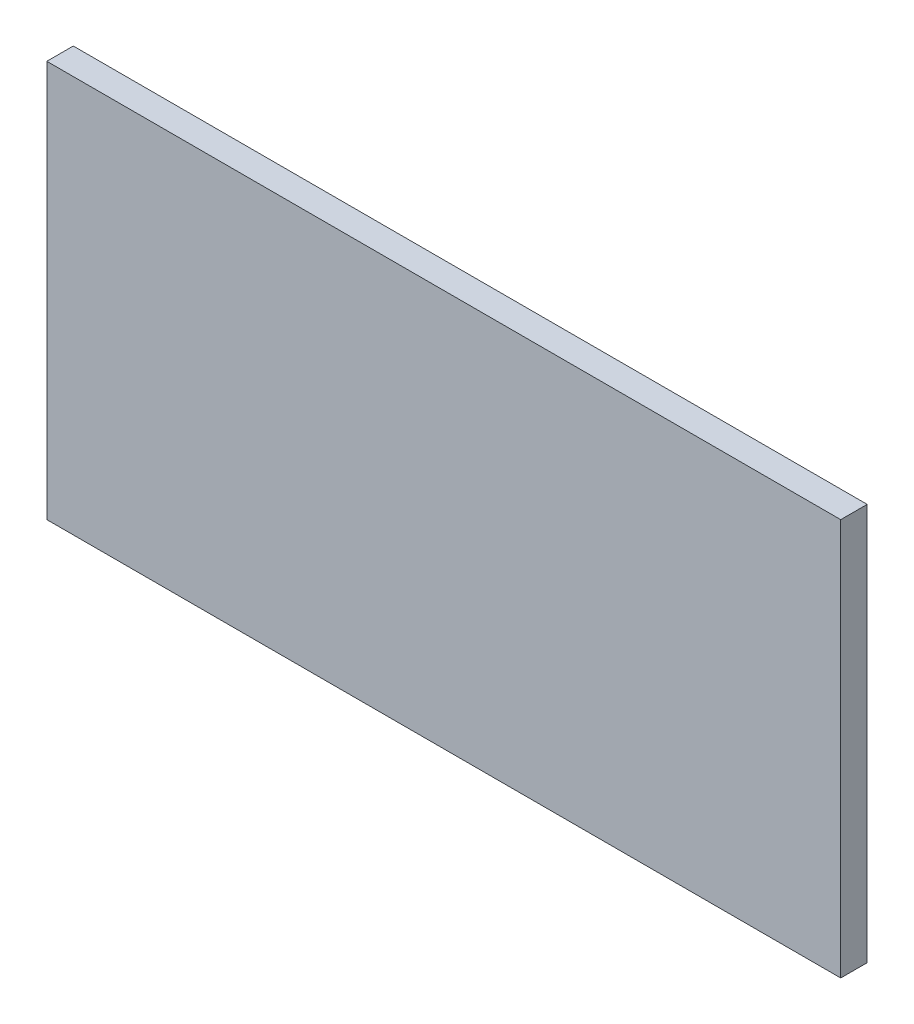
ISO-10303-21;
HEADER;
FILE_DESCRIPTION(('STEP AP214'),'2;1');
FILE_NAME('part.step','',(''),(''),'','','');
FILE_SCHEMA(('AUTOMOTIVE_DESIGN { 1 0 10303 214 1 1 1 1 }'));
ENDSEC;
DATA;
#1=APPLICATION_CONTEXT('core data for automotive mechanical design processes');
#2=APPLICATION_PROTOCOL_DEFINITION('international standard','automotive_design',2000,#1);
#3=PRODUCT_CONTEXT('',#1,'mechanical');
#4=PRODUCT('Part','Part','',(#3));
#5=PRODUCT_RELATED_PRODUCT_CATEGORY('part','',(#4));
#6=PRODUCT_DEFINITION_FORMATION('','',#4);
#7=PRODUCT_DEFINITION_CONTEXT('part definition',#1,'design');
#8=PRODUCT_DEFINITION('design','',#6,#7);
#9=PRODUCT_DEFINITION_SHAPE('','',#8);
#10=(LENGTH_UNIT() NAMED_UNIT(*) SI_UNIT(.MILLI.,.METRE.));
#11=(NAMED_UNIT(*) PLANE_ANGLE_UNIT() SI_UNIT($,.RADIAN.));
#12=(NAMED_UNIT(*) SI_UNIT($,.STERADIAN.) SOLID_ANGLE_UNIT());
#13=UNCERTAINTY_MEASURE_WITH_UNIT(LENGTH_MEASURE(1.E-05),#10,'distance_accuracy_value','');
#14=(GEOMETRIC_REPRESENTATION_CONTEXT(3) GLOBAL_UNCERTAINTY_ASSIGNED_CONTEXT((#13)) GLOBAL_UNIT_ASSIGNED_CONTEXT((#10,
#11,#12)) REPRESENTATION_CONTEXT('',''));
#15=CARTESIAN_POINT('',(0.,0.,0.));
#16=DIRECTION('',(0.,0.,1.));
#17=DIRECTION('',(1.,0.,0.));
#18=AXIS2_PLACEMENT_3D('',#15,#16,#17);
#19=CARTESIAN_POINT('',(-90.,-45.,-6.));
#20=DIRECTION('',(-1.,0.,0.));
#21=DIRECTION('',(0.,0.,1.));
#22=AXIS2_PLACEMENT_3D('',#19,#20,#21);
#23=PLANE('',#22);
#24=DIRECTION('',(0.,-1.,0.));
#25=VECTOR('',#24,1.);
#26=CARTESIAN_POINT('',(-90.,-45.,0.));
#27=LINE('',#26,#25);
#28=CARTESIAN_POINT('',(-90.,45.,0.));
#29=VERTEX_POINT('',#28);
#30=CARTESIAN_POINT('',(-90.,-45.,0.));
#31=VERTEX_POINT('',#30);
#32=EDGE_CURVE('E105',#29,#31,#27,.T.);
#33=ORIENTED_EDGE('',*,*,#32,.F.);
#34=DIRECTION('',(0.,0.,1.));
#35=VECTOR('',#34,1.);
#36=CARTESIAN_POINT('',(-90.,45.,-6.));
#37=LINE('',#36,#35);
#38=CARTESIAN_POINT('',(-90.,45.,-6.));
#39=VERTEX_POINT('',#38);
#40=EDGE_CURVE('E11',#39,#29,#37,.T.);
#41=ORIENTED_EDGE('',*,*,#40,.F.);
#42=DIRECTION('',(0.,-1.,0.));
#43=VECTOR('',#42,1.);
#44=CARTESIAN_POINT('',(-90.,-45.,-6.));
#45=LINE('',#44,#43);
#46=CARTESIAN_POINT('',(-90.,-45.,-6.));
#47=VERTEX_POINT('',#46);
#48=EDGE_CURVE('E99',#39,#47,#45,.T.);
#49=ORIENTED_EDGE('',*,*,#48,.T.);
#50=DIRECTION('',(0.,0.,1.));
#51=VECTOR('',#50,1.);
#52=CARTESIAN_POINT('',(-90.,-45.,-6.));
#53=LINE('',#52,#51);
#54=EDGE_CURVE('E44',#47,#31,#53,.T.);
#55=ORIENTED_EDGE('',*,*,#54,.T.);
#56=EDGE_LOOP('',(#33,#41,#49,#55));
#57=FACE_BOUND('',#56,.T.);
#58=ADVANCED_FACE('F41',(#57),#23,.T.);
#59=CARTESIAN_POINT('',(-90.,45.,-6.));
#60=DIRECTION('',(0.,1.,0.));
#61=DIRECTION('',(0.,0.,1.));
#62=AXIS2_PLACEMENT_3D('',#59,#60,#61);
#63=PLANE('',#62);
#64=DIRECTION('',(-1.,0.,0.));
#65=VECTOR('',#64,1.);
#66=CARTESIAN_POINT('',(-90.,45.,0.));
#67=LINE('',#66,#65);
#68=CARTESIAN_POINT('',(90.,45.,0.));
#69=VERTEX_POINT('',#68);
#70=EDGE_CURVE('E101',#69,#29,#67,.T.);
#71=ORIENTED_EDGE('',*,*,#70,.F.);
#72=DIRECTION('',(0.,0.,1.));
#73=VECTOR('',#72,1.);
#74=CARTESIAN_POINT('',(90.,45.,-6.));
#75=LINE('',#74,#73);
#76=CARTESIAN_POINT('',(90.,45.,-6.));
#77=VERTEX_POINT('',#76);
#78=EDGE_CURVE('E50',#77,#69,#75,.T.);
#79=ORIENTED_EDGE('',*,*,#78,.F.);
#80=DIRECTION('',(-1.,0.,0.));
#81=VECTOR('',#80,1.);
#82=CARTESIAN_POINT('',(-90.,45.,-6.));
#83=LINE('',#82,#81);
#84=EDGE_CURVE('E96',#77,#39,#83,.T.);
#85=ORIENTED_EDGE('',*,*,#84,.T.);
#86=ORIENTED_EDGE('',*,*,#40,.T.);
#87=EDGE_LOOP('',(#71,#79,#85,#86));
#88=FACE_BOUND('',#87,.T.);
#89=ADVANCED_FACE('F115',(#88),#63,.T.);
#90=CARTESIAN_POINT('',(90.,-45.,-6.));
#91=DIRECTION('',(1.,0.,0.));
#92=DIRECTION('',(0.,0.,-1.));
#93=AXIS2_PLACEMENT_3D('',#90,#91,#92);
#94=PLANE('',#93);
#95=DIRECTION('',(0.,1.,0.));
#96=VECTOR('',#95,1.);
#97=CARTESIAN_POINT('',(90.,-45.,0.));
#98=LINE('',#97,#96);
#99=CARTESIAN_POINT('',(90.,-45.,0.));
#100=VERTEX_POINT('',#99);
#101=EDGE_CURVE('E91',#100,#69,#98,.T.);
#102=ORIENTED_EDGE('',*,*,#101,.F.);
#103=DIRECTION('',(0.,0.,1.));
#104=VECTOR('',#103,1.);
#105=CARTESIAN_POINT('',(90.,-45.,-6.));
#106=LINE('',#105,#104);
#107=CARTESIAN_POINT('',(90.,-45.,-6.));
#108=VERTEX_POINT('',#107);
#109=EDGE_CURVE('E86',#108,#100,#106,.T.);
#110=ORIENTED_EDGE('',*,*,#109,.F.);
#111=DIRECTION('',(0.,1.,0.));
#112=VECTOR('',#111,1.);
#113=CARTESIAN_POINT('',(90.,-45.,-6.));
#114=LINE('',#113,#112);
#115=EDGE_CURVE('E89',#108,#77,#114,.T.);
#116=ORIENTED_EDGE('',*,*,#115,.T.);
#117=ORIENTED_EDGE('',*,*,#78,.T.);
#118=EDGE_LOOP('',(#102,#110,#116,#117));
#119=FACE_BOUND('',#118,.T.);
#120=ADVANCED_FACE('F88',(#119),#94,.T.);
#121=CARTESIAN_POINT('',(-90.,-45.,-6.));
#122=DIRECTION('',(0.,-1.,0.));
#123=DIRECTION('',(0.,0.,-1.));
#124=AXIS2_PLACEMENT_3D('',#121,#122,#123);
#125=PLANE('',#124);
#126=DIRECTION('',(1.,0.,0.));
#127=VECTOR('',#126,1.);
#128=CARTESIAN_POINT('',(-90.,-45.,0.));
#129=LINE('',#128,#127);
#130=EDGE_CURVE('E108',#31,#100,#129,.T.);
#131=ORIENTED_EDGE('',*,*,#130,.F.);
#132=ORIENTED_EDGE('',*,*,#54,.F.);
#133=DIRECTION('',(1.,0.,0.));
#134=VECTOR('',#133,1.);
#135=CARTESIAN_POINT('',(-90.,-45.,-6.));
#136=LINE('',#135,#134);
#137=EDGE_CURVE('E95',#47,#108,#136,.T.);
#138=ORIENTED_EDGE('',*,*,#137,.T.);
#139=ORIENTED_EDGE('',*,*,#109,.T.);
#140=EDGE_LOOP('',(#131,#132,#138,#139));
#141=FACE_BOUND('',#140,.T.);
#142=ADVANCED_FACE('F98',(#141),#125,.T.);
#143=CARTESIAN_POINT('',(0.,0.,-6.));
#144=DIRECTION('',(0.,0.,-1.));
#145=DIRECTION('',(-1.,0.,0.));
#146=AXIS2_PLACEMENT_3D('',#143,#144,#145);
#147=PLANE('',#146);
#148=ORIENTED_EDGE('',*,*,#48,.F.);
#149=ORIENTED_EDGE('',*,*,#84,.F.);
#150=ORIENTED_EDGE('',*,*,#115,.F.);
#151=ORIENTED_EDGE('',*,*,#137,.F.);
#152=EDGE_LOOP('',(#148,#149,#150,#151));
#153=FACE_BOUND('',#152,.T.);
#154=ADVANCED_FACE('F94',(#153),#147,.T.);
#155=CARTESIAN_POINT('',(0.,0.,0.));
#156=DIRECTION('',(0.,0.,-1.));
#157=DIRECTION('',(-1.,0.,0.));
#158=AXIS2_PLACEMENT_3D('',#155,#156,#157);
#159=PLANE('',#158);
#160=ORIENTED_EDGE('',*,*,#32,.T.);
#161=ORIENTED_EDGE('',*,*,#130,.T.);
#162=ORIENTED_EDGE('',*,*,#101,.T.);
#163=ORIENTED_EDGE('',*,*,#70,.T.);
#164=EDGE_LOOP('',(#160,#161,#162,#163));
#165=FACE_BOUND('',#164,.T.);
#166=ADVANCED_FACE('F114',(#165),#159,.F.);
#167=CLOSED_SHELL('',(#58,#89,#120,#142,#154,#166));
#168=MANIFOLD_SOLID_BREP('B2',#167);
#169=ADVANCED_BREP_SHAPE_REPRESENTATION('',(#18,#168),#14);
#170=SHAPE_DEFINITION_REPRESENTATION(#9,#169);
ENDSEC;
END-ISO-10303-21;
